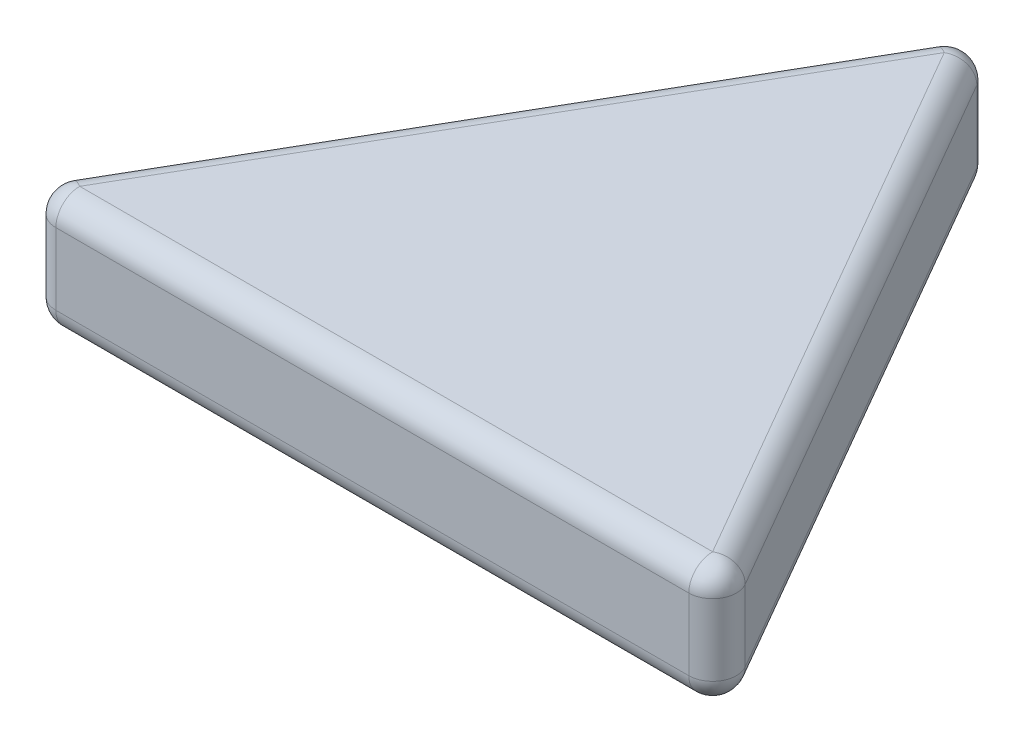
ISO-10303-21;
HEADER;
FILE_DESCRIPTION(('STEP AP214'),'2;1');
FILE_NAME('part.step','',(''),(''),'','','');
FILE_SCHEMA(('AUTOMOTIVE_DESIGN { 1 0 10303 214 1 1 1 1 }'));
ENDSEC;
DATA;
#1=APPLICATION_CONTEXT('core data for automotive mechanical design processes');
#2=APPLICATION_PROTOCOL_DEFINITION('international standard','automotive_design',2000,#1);
#3=PRODUCT_CONTEXT('',#1,'mechanical');
#4=PRODUCT('Part','Part','',(#3));
#5=PRODUCT_RELATED_PRODUCT_CATEGORY('part','',(#4));
#6=PRODUCT_DEFINITION_FORMATION('','',#4);
#7=PRODUCT_DEFINITION_CONTEXT('part definition',#1,'design');
#8=PRODUCT_DEFINITION('design','',#6,#7);
#9=PRODUCT_DEFINITION_SHAPE('','',#8);
#10=(LENGTH_UNIT() NAMED_UNIT(*) SI_UNIT(.MILLI.,.METRE.));
#11=(NAMED_UNIT(*) PLANE_ANGLE_UNIT() SI_UNIT($,.RADIAN.));
#12=(NAMED_UNIT(*) SI_UNIT($,.STERADIAN.) SOLID_ANGLE_UNIT());
#13=UNCERTAINTY_MEASURE_WITH_UNIT(LENGTH_MEASURE(1.E-05),#10,'distance_accuracy_value','');
#14=(GEOMETRIC_REPRESENTATION_CONTEXT(3) GLOBAL_UNCERTAINTY_ASSIGNED_CONTEXT((#13)) GLOBAL_UNIT_ASSIGNED_CONTEXT((#10,
#11,#12)) REPRESENTATION_CONTEXT('',''));
#15=CARTESIAN_POINT('',(0.,0.,0.));
#16=DIRECTION('',(0.,0.,1.));
#17=DIRECTION('',(1.,0.,0.));
#18=AXIS2_PLACEMENT_3D('',#15,#16,#17);
#19=CARTESIAN_POINT('',(30.,5.,0.));
#20=DIRECTION('',(0.,0.,-1.));
#21=DIRECTION('',(-1.,0.,0.));
#22=AXIS2_PLACEMENT_3D('',#19,#20,#21);
#23=PLANE('',#22);
#24=DIRECTION('',(1.,0.,0.));
#25=VECTOR('',#24,1.);
#26=CARTESIAN_POINT('',(30.,4.,0.));
#27=LINE('',#26,#25);
#28=CARTESIAN_POINT('',(28.2679491924311,4.,0.));
#29=VERTEX_POINT('',#28);
#30=CARTESIAN_POINT('',(1.73205080756888,4.,0.));
#31=VERTEX_POINT('',#30);
#32=EDGE_CURVE('E155',#29,#31,#27,.F.);
#33=ORIENTED_EDGE('',*,*,#32,.T.);
#34=DIRECTION('',(0.,-1.,0.));
#35=VECTOR('',#34,1.);
#36=CARTESIAN_POINT('',(1.73205080756888,5.,0.));
#37=LINE('',#36,#35);
#38=CARTESIAN_POINT('',(1.73205080756888,1.,0.));
#39=VERTEX_POINT('',#38);
#40=EDGE_CURVE('E161',#31,#39,#37,.T.);
#41=ORIENTED_EDGE('',*,*,#40,.T.);
#42=DIRECTION('',(1.,0.,0.));
#43=VECTOR('',#42,1.);
#44=CARTESIAN_POINT('',(30.,1.,0.));
#45=LINE('',#44,#43);
#46=CARTESIAN_POINT('',(28.2679491924311,1.,0.));
#47=VERTEX_POINT('',#46);
#48=EDGE_CURVE('E159',#39,#47,#45,.T.);
#49=ORIENTED_EDGE('',*,*,#48,.T.);
#50=DIRECTION('',(0.,-1.,0.));
#51=VECTOR('',#50,1.);
#52=CARTESIAN_POINT('',(28.2679491924311,5.,0.));
#53=LINE('',#52,#51);
#54=EDGE_CURVE('E157',#47,#29,#53,.F.);
#55=ORIENTED_EDGE('',*,*,#54,.T.);
#56=EDGE_LOOP('',(#33,#41,#49,#55));
#57=FACE_BOUND('',#56,.T.);
#58=ADVANCED_FACE('F33',(#57),#23,.F.);
#59=CARTESIAN_POINT('',(15.,5.,-25.9807621135332));
#60=DIRECTION('',(-0.866025403784439,0.,0.5));
#61=DIRECTION('',(0.5,0.,0.866025403784439));
#62=AXIS2_PLACEMENT_3D('',#59,#60,#61);
#63=PLANE('',#62);
#64=DIRECTION('',(-0.5,0.,-0.866025403784439));
#65=VECTOR('',#64,1.);
#66=CARTESIAN_POINT('',(15.,1.,-25.9807621135332));
#67=LINE('',#66,#65);
#68=CARTESIAN_POINT('',(29.1339745962156,1.,-1.5));
#69=VERTEX_POINT('',#68);
#70=CARTESIAN_POINT('',(15.8660254037844,1.,-24.4807621135332));
#71=VERTEX_POINT('',#70);
#72=EDGE_CURVE('E145',#69,#71,#67,.T.);
#73=ORIENTED_EDGE('',*,*,#72,.T.);
#74=DIRECTION('',(0.,-1.,0.));
#75=VECTOR('',#74,1.);
#76=CARTESIAN_POINT('',(15.8660254037844,5.,-24.4807621135332));
#77=LINE('',#76,#75);
#78=CARTESIAN_POINT('',(15.8660254037844,4.,-24.4807621135332));
#79=VERTEX_POINT('',#78);
#80=EDGE_CURVE('E113',#71,#79,#77,.F.);
#81=ORIENTED_EDGE('',*,*,#80,.T.);
#82=DIRECTION('',(-0.5,0.,-0.866025403784439));
#83=VECTOR('',#82,1.);
#84=CARTESIAN_POINT('',(15.,4.,-25.9807621135332));
#85=LINE('',#84,#83);
#86=CARTESIAN_POINT('',(29.1339745962156,4.,-1.5));
#87=VERTEX_POINT('',#86);
#88=EDGE_CURVE('E137',#79,#87,#85,.F.);
#89=ORIENTED_EDGE('',*,*,#88,.T.);
#90=DIRECTION('',(0.,-1.,0.));
#91=VECTOR('',#90,1.);
#92=CARTESIAN_POINT('',(29.1339745962156,5.,-1.5));
#93=LINE('',#92,#91);
#94=EDGE_CURVE('E139',#87,#69,#93,.T.);
#95=ORIENTED_EDGE('',*,*,#94,.T.);
#96=EDGE_LOOP('',(#73,#81,#89,#95));
#97=FACE_BOUND('',#96,.T.);
#98=ADVANCED_FACE('F247',(#97),#63,.F.);
#99=CARTESIAN_POINT('',(0.,5.,0.));
#100=DIRECTION('',(0.866025403784439,0.,0.5));
#101=DIRECTION('',(0.5,0.,-0.866025403784439));
#102=AXIS2_PLACEMENT_3D('',#99,#100,#101);
#103=PLANE('',#102);
#104=DIRECTION('',(-0.5,0.,0.866025403784439));
#105=VECTOR('',#104,1.);
#106=CARTESIAN_POINT('',(0.,4.,0.));
#107=LINE('',#106,#105);
#108=CARTESIAN_POINT('',(0.866025403784439,4.,-1.5));
#109=VERTEX_POINT('',#108);
#110=CARTESIAN_POINT('',(14.1339745962156,4.,-24.4807621135332));
#111=VERTEX_POINT('',#110);
#112=EDGE_CURVE('E135',#109,#111,#107,.F.);
#113=ORIENTED_EDGE('',*,*,#112,.T.);
#114=DIRECTION('',(0.,-1.,0.));
#115=VECTOR('',#114,1.);
#116=CARTESIAN_POINT('',(14.1339745962156,5.,-24.4807621135332));
#117=LINE('',#116,#115);
#118=CARTESIAN_POINT('',(14.1339745962156,1.,-24.4807621135332));
#119=VERTEX_POINT('',#118);
#120=EDGE_CURVE('E111',#111,#119,#117,.T.);
#121=ORIENTED_EDGE('',*,*,#120,.T.);
#122=DIRECTION('',(-0.5,0.,0.866025403784439));
#123=VECTOR('',#122,1.);
#124=CARTESIAN_POINT('',(0.,1.,0.));
#125=LINE('',#124,#123);
#126=CARTESIAN_POINT('',(0.866025403784439,1.,-1.5));
#127=VERTEX_POINT('',#126);
#128=EDGE_CURVE('E125',#119,#127,#125,.T.);
#129=ORIENTED_EDGE('',*,*,#128,.T.);
#130=DIRECTION('',(0.,-1.,0.));
#131=VECTOR('',#130,1.);
#132=CARTESIAN_POINT('',(0.866025403784439,5.,-1.5));
#133=LINE('',#132,#131);
#134=EDGE_CURVE('E131',#127,#109,#133,.F.);
#135=ORIENTED_EDGE('',*,*,#134,.T.);
#136=EDGE_LOOP('',(#113,#121,#129,#135));
#137=FACE_BOUND('',#136,.T.);
#138=ADVANCED_FACE('F133',(#137),#103,.F.);
#139=CARTESIAN_POINT('',(0.,5.,0.));
#140=DIRECTION('',(0.,-1.,0.));
#141=DIRECTION('',(0.,0.,-1.));
#142=AXIS2_PLACEMENT_3D('',#139,#140,#141);
#143=PLANE('',#142);
#144=DIRECTION('',(-0.5,0.,-0.866025403784439));
#145=VECTOR('',#144,1.);
#146=CARTESIAN_POINT('',(21.6339745962156,5.,-12.4903810567666));
#147=LINE('',#146,#145);
#148=CARTESIAN_POINT('',(28.2679491924311,5.,-1.));
#149=VERTEX_POINT('',#148);
#150=CARTESIAN_POINT('',(15.,5.,-23.9807621135332));
#151=VERTEX_POINT('',#150);
#152=EDGE_CURVE('E150',#149,#151,#147,.T.);
#153=ORIENTED_EDGE('',*,*,#152,.T.);
#154=DIRECTION('',(-0.5,0.,0.866025403784439));
#155=VECTOR('',#154,1.);
#156=CARTESIAN_POINT('',(0.866025403784439,5.,0.5));
#157=LINE('',#156,#155);
#158=CARTESIAN_POINT('',(1.73205080756888,5.,-1.));
#159=VERTEX_POINT('',#158);
#160=EDGE_CURVE('E152',#151,#159,#157,.T.);
#161=ORIENTED_EDGE('',*,*,#160,.T.);
#162=DIRECTION('',(1.,0.,0.));
#163=VECTOR('',#162,1.);
#164=CARTESIAN_POINT('',(0.,5.,-1.));
#165=LINE('',#164,#163);
#166=EDGE_CURVE('E148',#159,#149,#165,.T.);
#167=ORIENTED_EDGE('',*,*,#166,.T.);
#168=EDGE_LOOP('',(#153,#161,#167));
#169=FACE_BOUND('',#168,.T.);
#170=ADVANCED_FACE('F216',(#169),#143,.F.);
#171=CARTESIAN_POINT('',(0.,0.,0.));
#172=DIRECTION('',(0.,-1.,0.));
#173=DIRECTION('',(0.,0.,-1.));
#174=AXIS2_PLACEMENT_3D('',#171,#172,#173);
#175=PLANE('',#174);
#176=DIRECTION('',(1.,0.,0.));
#177=VECTOR('',#176,1.);
#178=CARTESIAN_POINT('',(0.,0.,-1.));
#179=LINE('',#178,#177);
#180=CARTESIAN_POINT('',(28.2679491924311,0.,-1.));
#181=VERTEX_POINT('',#180);
#182=CARTESIAN_POINT('',(1.73205080756888,0.,-1.));
#183=VERTEX_POINT('',#182);
#184=EDGE_CURVE('E57',#181,#183,#179,.F.);
#185=ORIENTED_EDGE('',*,*,#184,.T.);
#186=DIRECTION('',(-0.5,0.,0.866025403784439));
#187=VECTOR('',#186,1.);
#188=CARTESIAN_POINT('',(15.8660254037844,0.,-25.4807621135332));
#189=LINE('',#188,#187);
#190=CARTESIAN_POINT('',(15.,0.,-23.9807621135332));
#191=VERTEX_POINT('',#190);
#192=EDGE_CURVE('E11',#183,#191,#189,.F.);
#193=ORIENTED_EDGE('',*,*,#192,.T.);
#194=DIRECTION('',(-0.5,0.,-0.866025403784439));
#195=VECTOR('',#194,1.);
#196=CARTESIAN_POINT('',(29.1339745962156,0.,0.499999999999997));
#197=LINE('',#196,#195);
#198=EDGE_CURVE('E42',#191,#181,#197,.F.);
#199=ORIENTED_EDGE('',*,*,#198,.T.);
#200=EDGE_LOOP('',(#185,#193,#199));
#201=FACE_BOUND('',#200,.T.);
#202=ADVANCED_FACE('F290',(#201),#175,.T.);
#203=CARTESIAN_POINT('',(0.,4.,-1.));
#204=DIRECTION('',(1.,0.,0.));
#205=DIRECTION('',(0.,0.,-1.));
#206=AXIS2_PLACEMENT_3D('',#203,#204,#205);
#207=CYLINDRICAL_SURFACE('',#206,1.);
#208=CARTESIAN_POINT('',(1.73205080756888,4.,-1.));
#209=DIRECTION('',(-1.,0.,0.));
#210=DIRECTION('',(0.,-1.,0.));
#211=AXIS2_PLACEMENT_3D('',#208,#209,#210);
#212=CIRCLE('',#211,1.);
#213=EDGE_CURVE('E196',#31,#159,#212,.T.);
#214=ORIENTED_EDGE('',*,*,#213,.F.);
#215=ORIENTED_EDGE('',*,*,#32,.F.);
#216=CARTESIAN_POINT('',(28.2679491924311,4.,-1.));
#217=DIRECTION('',(1.,0.,0.));
#218=DIRECTION('',(0.,0.,-1.));
#219=AXIS2_PLACEMENT_3D('',#216,#217,#218);
#220=CIRCLE('',#219,1.);
#221=EDGE_CURVE('E198',#149,#29,#220,.T.);
#222=ORIENTED_EDGE('',*,*,#221,.F.);
#223=ORIENTED_EDGE('',*,*,#166,.F.);
#224=EDGE_LOOP('',(#214,#215,#222,#223));
#225=FACE_BOUND('',#224,.T.);
#226=ADVANCED_FACE('F35',(#225),#207,.T.);
#227=CARTESIAN_POINT('',(1.73205080756888,5.,-1.));
#228=DIRECTION('',(0.,-1.,0.));
#229=DIRECTION('',(0.,0.,-1.));
#230=AXIS2_PLACEMENT_3D('',#227,#228,#229);
#231=CYLINDRICAL_SURFACE('',#230,1.);
#232=CARTESIAN_POINT('',(1.73205080756888,1.,-1.));
#233=DIRECTION('',(0.,-1.,0.));
#234=DIRECTION('',(0.,0.,-1.));
#235=AXIS2_PLACEMENT_3D('',#232,#233,#234);
#236=CIRCLE('',#235,1.);
#237=EDGE_CURVE('E190',#39,#127,#236,.T.);
#238=ORIENTED_EDGE('',*,*,#237,.F.);
#239=ORIENTED_EDGE('',*,*,#40,.F.);
#240=CARTESIAN_POINT('',(1.73205080756888,4.,-1.));
#241=DIRECTION('',(0.,1.,0.));
#242=DIRECTION('',(0.,0.,1.));
#243=AXIS2_PLACEMENT_3D('',#240,#241,#242);
#244=CIRCLE('',#243,1.);
#245=EDGE_CURVE('E193',#109,#31,#244,.T.);
#246=ORIENTED_EDGE('',*,*,#245,.F.);
#247=ORIENTED_EDGE('',*,*,#134,.F.);
#248=EDGE_LOOP('',(#238,#239,#246,#247));
#249=FACE_BOUND('',#248,.T.);
#250=ADVANCED_FACE('F232',(#249),#231,.T.);
#251=CARTESIAN_POINT('',(30.,1.,-1.));
#252=DIRECTION('',(-1.,0.,0.));
#253=DIRECTION('',(0.,0.,1.));
#254=AXIS2_PLACEMENT_3D('',#251,#252,#253);
#255=CYLINDRICAL_SURFACE('',#254,1.);
#256=CARTESIAN_POINT('',(28.2679491924311,1.,-1.));
#257=DIRECTION('',(1.,0.,0.));
#258=DIRECTION('',(0.,0.,-1.));
#259=AXIS2_PLACEMENT_3D('',#256,#257,#258);
#260=CIRCLE('',#259,1.);
#261=EDGE_CURVE('E185',#47,#181,#260,.T.);
#262=ORIENTED_EDGE('',*,*,#261,.F.);
#263=ORIENTED_EDGE('',*,*,#48,.F.);
#264=CARTESIAN_POINT('',(1.73205080756888,1.,-1.));
#265=DIRECTION('',(-1.,0.,0.));
#266=DIRECTION('',(0.,0.,1.));
#267=AXIS2_PLACEMENT_3D('',#264,#265,#266);
#268=CIRCLE('',#267,1.);
#269=EDGE_CURVE('E188',#183,#39,#268,.T.);
#270=ORIENTED_EDGE('',*,*,#269,.F.);
#271=ORIENTED_EDGE('',*,*,#184,.F.);
#272=EDGE_LOOP('',(#262,#263,#270,#271));
#273=FACE_BOUND('',#272,.T.);
#274=ADVANCED_FACE('F237',(#273),#255,.T.);
#275=CARTESIAN_POINT('',(28.2679491924311,5.,-1.));
#276=DIRECTION('',(0.,-1.,0.));
#277=DIRECTION('',(0.,0.,-1.));
#278=AXIS2_PLACEMENT_3D('',#275,#276,#277);
#279=CYLINDRICAL_SURFACE('',#278,1.);
#280=CARTESIAN_POINT('',(28.2679491924311,4.,-1.));
#281=DIRECTION('',(0.,1.,0.));
#282=DIRECTION('',(0.,0.,1.));
#283=AXIS2_PLACEMENT_3D('',#280,#281,#282);
#284=CIRCLE('',#283,1.);
#285=EDGE_CURVE('E37',#29,#87,#284,.T.);
#286=ORIENTED_EDGE('',*,*,#285,.F.);
#287=ORIENTED_EDGE('',*,*,#54,.F.);
#288=CARTESIAN_POINT('',(28.2679491924311,1.,-1.));
#289=DIRECTION('',(0.,-1.,0.));
#290=DIRECTION('',(0.,0.,-1.));
#291=AXIS2_PLACEMENT_3D('',#288,#289,#290);
#292=CIRCLE('',#291,1.);
#293=EDGE_CURVE('E182',#69,#47,#292,.T.);
#294=ORIENTED_EDGE('',*,*,#293,.F.);
#295=ORIENTED_EDGE('',*,*,#94,.F.);
#296=EDGE_LOOP('',(#286,#287,#294,#295));
#297=FACE_BOUND('',#296,.T.);
#298=ADVANCED_FACE('F239',(#297),#279,.T.);
#299=CARTESIAN_POINT('',(28.2679491924311,4.,-1.));
#300=DIRECTION('',(0.,1.,0.));
#301=DIRECTION('',(-1.,0.,0.));
#302=AXIS2_PLACEMENT_3D('',#299,#300,#301);
#303=SPHERICAL_SURFACE('',#302,1.);
#304=ORIENTED_EDGE('',*,*,#221,.T.);
#305=ORIENTED_EDGE('',*,*,#285,.T.);
#306=CARTESIAN_POINT('',(28.2679491924311,4.,-1.));
#307=DIRECTION('',(0.5,0.,0.866025403784439));
#308=DIRECTION('',(0.866025403784439,0.,-0.5));
#309=AXIS2_PLACEMENT_3D('',#306,#307,#308);
#310=CIRCLE('',#309,1.);
#311=EDGE_CURVE('E179',#149,#87,#310,.F.);
#312=ORIENTED_EDGE('',*,*,#311,.F.);
#313=EDGE_LOOP('',(#304,#305,#312));
#314=FACE_BOUND('',#313,.T.);
#315=ADVANCED_FACE('F205',(#314),#303,.T.);
#316=CARTESIAN_POINT('',(1.73205080756888,4.,-1.));
#317=DIRECTION('',(0.,1.,0.));
#318=DIRECTION('',(0.,0.,1.));
#319=AXIS2_PLACEMENT_3D('',#316,#317,#318);
#320=SPHERICAL_SURFACE('',#319,1.);
#321=ORIENTED_EDGE('',*,*,#245,.T.);
#322=ORIENTED_EDGE('',*,*,#213,.T.);
#323=CARTESIAN_POINT('',(1.73205080756888,4.,-1.));
#324=DIRECTION('',(-0.500000000000001,0.,0.866025403784438));
#325=DIRECTION('',(0.866025403784438,0.,0.500000000000001));
#326=AXIS2_PLACEMENT_3D('',#323,#324,#325);
#327=CIRCLE('',#326,1.);
#328=EDGE_CURVE('E177',#109,#159,#327,.F.);
#329=ORIENTED_EDGE('',*,*,#328,.F.);
#330=EDGE_LOOP('',(#321,#322,#329));
#331=FACE_BOUND('',#330,.T.);
#332=ADVANCED_FACE('F224',(#331),#320,.T.);
#333=CARTESIAN_POINT('',(1.73205080756888,1.,-1.));
#334=DIRECTION('',(0.,-1.,0.));
#335=DIRECTION('',(1.,0.,0.));
#336=AXIS2_PLACEMENT_3D('',#333,#334,#335);
#337=SPHERICAL_SURFACE('',#336,1.);
#338=ORIENTED_EDGE('',*,*,#269,.T.);
#339=ORIENTED_EDGE('',*,*,#237,.T.);
#340=CARTESIAN_POINT('',(1.73205080756888,1.,-1.));
#341=DIRECTION('',(-0.5,0.,0.866025403784439));
#342=DIRECTION('',(0.866025403784439,0.,0.5));
#343=AXIS2_PLACEMENT_3D('',#340,#341,#342);
#344=CIRCLE('',#343,1.);
#345=EDGE_CURVE('E128',#183,#127,#344,.F.);
#346=ORIENTED_EDGE('',*,*,#345,.F.);
#347=EDGE_LOOP('',(#338,#339,#346));
#348=FACE_BOUND('',#347,.T.);
#349=ADVANCED_FACE('F276',(#348),#337,.T.);
#350=CARTESIAN_POINT('',(28.2679491924311,1.,-1.));
#351=DIRECTION('',(0.,-1.,0.));
#352=DIRECTION('',(0.,0.,-1.));
#353=AXIS2_PLACEMENT_3D('',#350,#351,#352);
#354=SPHERICAL_SURFACE('',#353,1.);
#355=ORIENTED_EDGE('',*,*,#293,.T.);
#356=ORIENTED_EDGE('',*,*,#261,.T.);
#357=CARTESIAN_POINT('',(28.2679491924311,1.,-1.));
#358=DIRECTION('',(0.5,0.,0.866025403784439));
#359=DIRECTION('',(0.866025403784439,0.,-0.5));
#360=AXIS2_PLACEMENT_3D('',#357,#358,#359);
#361=CIRCLE('',#360,1.);
#362=EDGE_CURVE('E173',#69,#181,#361,.F.);
#363=ORIENTED_EDGE('',*,*,#362,.F.);
#364=EDGE_LOOP('',(#355,#356,#363));
#365=FACE_BOUND('',#364,.T.);
#366=ADVANCED_FACE('F243',(#365),#354,.T.);
#367=CARTESIAN_POINT('',(21.6339745962156,4.,-12.4903810567666));
#368=DIRECTION('',(-0.5,0.,-0.866025403784439));
#369=DIRECTION('',(-0.866025403784439,0.,0.5));
#370=AXIS2_PLACEMENT_3D('',#367,#368,#369);
#371=CYLINDRICAL_SURFACE('',#370,1.);
#372=ORIENTED_EDGE('',*,*,#311,.T.);
#373=ORIENTED_EDGE('',*,*,#88,.F.);
#374=CARTESIAN_POINT('',(15.,4.,-23.9807621135332));
#375=DIRECTION('',(-0.500000000000001,0.,-0.866025403784438));
#376=DIRECTION('',(-0.866025403784438,0.,0.500000000000001));
#377=AXIS2_PLACEMENT_3D('',#374,#375,#376);
#378=CIRCLE('',#377,1.);
#379=EDGE_CURVE('E170',#151,#79,#378,.T.);
#380=ORIENTED_EDGE('',*,*,#379,.F.);
#381=ORIENTED_EDGE('',*,*,#152,.F.);
#382=EDGE_LOOP('',(#372,#373,#380,#381));
#383=FACE_BOUND('',#382,.T.);
#384=ADVANCED_FACE('F212',(#383),#371,.T.);
#385=CARTESIAN_POINT('',(0.866025403784439,4.,0.5));
#386=DIRECTION('',(-0.5,0.,0.866025403784439));
#387=DIRECTION('',(0.866025403784439,0.,0.5));
#388=AXIS2_PLACEMENT_3D('',#385,#386,#387);
#389=CYLINDRICAL_SURFACE('',#388,1.);
#390=ORIENTED_EDGE('',*,*,#328,.T.);
#391=ORIENTED_EDGE('',*,*,#160,.F.);
#392=CARTESIAN_POINT('',(15.,4.,-23.9807621135332));
#393=DIRECTION('',(0.5,0.,-0.866025403784439));
#394=DIRECTION('',(-0.866025403784439,0.,-0.5));
#395=AXIS2_PLACEMENT_3D('',#392,#393,#394);
#396=CIRCLE('',#395,1.);
#397=EDGE_CURVE('E122',#111,#151,#396,.T.);
#398=ORIENTED_EDGE('',*,*,#397,.F.);
#399=ORIENTED_EDGE('',*,*,#112,.F.);
#400=EDGE_LOOP('',(#390,#391,#398,#399));
#401=FACE_BOUND('',#400,.T.);
#402=ADVANCED_FACE('F219',(#401),#389,.T.);
#403=CARTESIAN_POINT('',(0.866025403784439,1.,0.5));
#404=DIRECTION('',(0.5,0.,-0.866025403784439));
#405=DIRECTION('',(-0.866025403784439,0.,-0.5));
#406=AXIS2_PLACEMENT_3D('',#403,#404,#405);
#407=CYLINDRICAL_SURFACE('',#406,1.);
#408=ORIENTED_EDGE('',*,*,#345,.T.);
#409=ORIENTED_EDGE('',*,*,#128,.F.);
#410=CARTESIAN_POINT('',(15.,1.,-23.9807621135332));
#411=DIRECTION('',(0.500000000000002,0.,-0.866025403784438));
#412=DIRECTION('',(-0.866025403784438,0.,-0.500000000000002));
#413=AXIS2_PLACEMENT_3D('',#410,#411,#412);
#414=CIRCLE('',#413,1.);
#415=EDGE_CURVE('E116',#191,#119,#414,.T.);
#416=ORIENTED_EDGE('',*,*,#415,.F.);
#417=ORIENTED_EDGE('',*,*,#192,.F.);
#418=EDGE_LOOP('',(#408,#409,#416,#417));
#419=FACE_BOUND('',#418,.T.);
#420=ADVANCED_FACE('F126',(#419),#407,.T.);
#421=CARTESIAN_POINT('',(14.1339745962156,1.,-25.4807621135332));
#422=DIRECTION('',(0.5,0.,0.866025403784439));
#423=DIRECTION('',(0.866025403784439,0.,-0.5));
#424=AXIS2_PLACEMENT_3D('',#421,#422,#423);
#425=CYLINDRICAL_SURFACE('',#424,1.);
#426=ORIENTED_EDGE('',*,*,#362,.T.);
#427=ORIENTED_EDGE('',*,*,#198,.F.);
#428=CARTESIAN_POINT('',(15.,1.,-23.9807621135332));
#429=DIRECTION('',(-0.5,0.,-0.866025403784439));
#430=DIRECTION('',(-0.866025403784439,0.,0.5));
#431=AXIS2_PLACEMENT_3D('',#428,#429,#430);
#432=CIRCLE('',#431,1.);
#433=EDGE_CURVE('E50',#71,#191,#432,.T.);
#434=ORIENTED_EDGE('',*,*,#433,.F.);
#435=ORIENTED_EDGE('',*,*,#72,.F.);
#436=EDGE_LOOP('',(#426,#427,#434,#435));
#437=FACE_BOUND('',#436,.T.);
#438=ADVANCED_FACE('F245',(#437),#425,.T.);
#439=CARTESIAN_POINT('',(15.,4.,-23.9807621135332));
#440=DIRECTION('',(0.,1.,0.));
#441=DIRECTION('',(0.,0.,1.));
#442=AXIS2_PLACEMENT_3D('',#439,#440,#441);
#443=SPHERICAL_SURFACE('',#442,1.);
#444=ORIENTED_EDGE('',*,*,#397,.T.);
#445=ORIENTED_EDGE('',*,*,#379,.T.);
#446=CARTESIAN_POINT('',(15.,4.,-23.9807621135332));
#447=DIRECTION('',(0.,1.,0.));
#448=DIRECTION('',(0.,0.,1.));
#449=AXIS2_PLACEMENT_3D('',#446,#447,#448);
#450=CIRCLE('',#449,1.);
#451=EDGE_CURVE('E114',#111,#79,#450,.F.);
#452=ORIENTED_EDGE('',*,*,#451,.F.);
#453=EDGE_LOOP('',(#444,#445,#452));
#454=FACE_BOUND('',#453,.T.);
#455=ADVANCED_FACE('F262',(#454),#443,.T.);
#456=CARTESIAN_POINT('',(15.,1.,-23.9807621135332));
#457=DIRECTION('',(0.,-1.,0.));
#458=DIRECTION('',(0.,0.,-1.));
#459=AXIS2_PLACEMENT_3D('',#456,#457,#458);
#460=SPHERICAL_SURFACE('',#459,1.);
#461=ORIENTED_EDGE('',*,*,#433,.T.);
#462=ORIENTED_EDGE('',*,*,#415,.T.);
#463=CARTESIAN_POINT('',(15.,1.,-23.9807621135332));
#464=DIRECTION('',(0.,-1.,0.));
#465=DIRECTION('',(0.,0.,-1.));
#466=AXIS2_PLACEMENT_3D('',#463,#464,#465);
#467=CIRCLE('',#466,1.);
#468=EDGE_CURVE('E108',#71,#119,#467,.F.);
#469=ORIENTED_EDGE('',*,*,#468,.F.);
#470=EDGE_LOOP('',(#461,#462,#469));
#471=FACE_BOUND('',#470,.T.);
#472=ADVANCED_FACE('F118',(#471),#460,.T.);
#473=CARTESIAN_POINT('',(15.,5.,-23.9807621135332));
#474=DIRECTION('',(0.,-1.,0.));
#475=DIRECTION('',(0.,0.,-1.));
#476=AXIS2_PLACEMENT_3D('',#473,#474,#475);
#477=CYLINDRICAL_SURFACE('',#476,1.);
#478=ORIENTED_EDGE('',*,*,#451,.T.);
#479=ORIENTED_EDGE('',*,*,#80,.F.);
#480=ORIENTED_EDGE('',*,*,#468,.T.);
#481=ORIENTED_EDGE('',*,*,#120,.F.);
#482=EDGE_LOOP('',(#478,#479,#480,#481));
#483=FACE_BOUND('',#482,.T.);
#484=ADVANCED_FACE('F109',(#483),#477,.T.);
#485=CLOSED_SHELL('',(#58,#98,#138,#170,#202,#226,#250,#274,#298,#315,#332,#349,#366,#384,#402,
#420,#438,#455,#472,#484));
#486=MANIFOLD_SOLID_BREP('B2',#485);
#487=ADVANCED_BREP_SHAPE_REPRESENTATION('',(#18,#486),#14);
#488=SHAPE_DEFINITION_REPRESENTATION(#9,#487);
ENDSEC;
END-ISO-10303-21;
